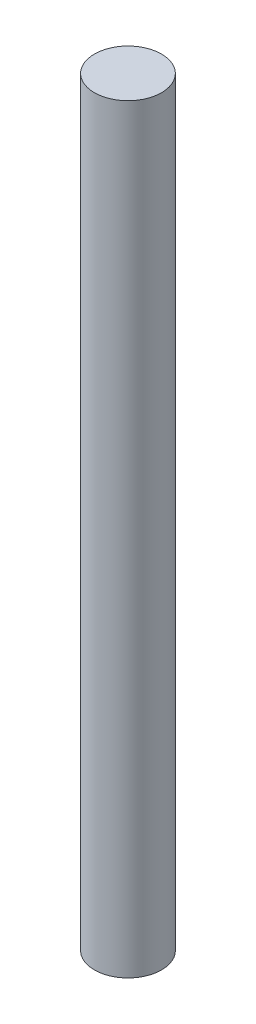
ISO-10303-21;
HEADER;
FILE_DESCRIPTION(('STEP AP214'),'2;1');
FILE_NAME('part.step','',(''),(''),'','','');
FILE_SCHEMA(('AUTOMOTIVE_DESIGN { 1 0 10303 214 1 1 1 1 }'));
ENDSEC;
DATA;
#1=APPLICATION_CONTEXT('core data for automotive mechanical design processes');
#2=APPLICATION_PROTOCOL_DEFINITION('international standard','automotive_design',2000,#1);
#3=PRODUCT_CONTEXT('',#1,'mechanical');
#4=PRODUCT('Part','Part','',(#3));
#5=PRODUCT_RELATED_PRODUCT_CATEGORY('part','',(#4));
#6=PRODUCT_DEFINITION_FORMATION('','',#4);
#7=PRODUCT_DEFINITION_CONTEXT('part definition',#1,'design');
#8=PRODUCT_DEFINITION('design','',#6,#7);
#9=PRODUCT_DEFINITION_SHAPE('','',#8);
#10=(LENGTH_UNIT() NAMED_UNIT(*) SI_UNIT(.MILLI.,.METRE.));
#11=(NAMED_UNIT(*) PLANE_ANGLE_UNIT() SI_UNIT($,.RADIAN.));
#12=(NAMED_UNIT(*) SI_UNIT($,.STERADIAN.) SOLID_ANGLE_UNIT());
#13=UNCERTAINTY_MEASURE_WITH_UNIT(LENGTH_MEASURE(1.E-05),#10,'distance_accuracy_value','');
#14=(GEOMETRIC_REPRESENTATION_CONTEXT(3) GLOBAL_UNCERTAINTY_ASSIGNED_CONTEXT((#13)) GLOBAL_UNIT_ASSIGNED_CONTEXT((#10,
#11,#12)) REPRESENTATION_CONTEXT('',''));
#15=CARTESIAN_POINT('',(0.,0.,0.));
#16=DIRECTION('',(0.,0.,1.));
#17=DIRECTION('',(1.,0.,0.));
#18=AXIS2_PLACEMENT_3D('',#15,#16,#17);
#19=CARTESIAN_POINT('',(0.,17.,0.));
#20=DIRECTION('',(0.,-1.,0.));
#21=DIRECTION('',(0.,0.,-1.));
#22=AXIS2_PLACEMENT_3D('',#19,#20,#21);
#23=CYLINDRICAL_SURFACE('',#22,1.5);
#24=CARTESIAN_POINT('',(0.,17.,0.));
#25=DIRECTION('',(0.,1.,0.));
#26=DIRECTION('',(0.,0.,1.));
#27=AXIS2_PLACEMENT_3D('',#24,#25,#26);
#28=CIRCLE('',#27,1.5);
#29=CARTESIAN_POINT('',(0.,17.,1.5));
#30=VERTEX_POINT('',#29);
#31=EDGE_CURVE('E10',#30,#30,#28,.T.);
#32=ORIENTED_EDGE('',*,*,#31,.F.);
#33=EDGE_LOOP('',(#32));
#34=FACE_BOUND('',#33,.T.);
#35=CARTESIAN_POINT('',(0.,-17.,0.));
#36=DIRECTION('',(0.,1.,0.));
#37=DIRECTION('',(0.,0.,1.));
#38=AXIS2_PLACEMENT_3D('',#35,#36,#37);
#39=CIRCLE('',#38,1.5);
#40=CARTESIAN_POINT('',(0.,-17.,1.5));
#41=VERTEX_POINT('',#40);
#42=EDGE_CURVE('E44',#41,#41,#39,.T.);
#43=ORIENTED_EDGE('',*,*,#42,.T.);
#44=EDGE_LOOP('',(#43));
#45=FACE_BOUND('',#44,.T.);
#46=ADVANCED_FACE('F41',(#34,#45),#23,.T.);
#47=CARTESIAN_POINT('',(0.,17.,0.));
#48=DIRECTION('',(0.,1.,0.));
#49=DIRECTION('',(0.,0.,1.));
#50=AXIS2_PLACEMENT_3D('',#47,#48,#49);
#51=PLANE('',#50);
#52=ORIENTED_EDGE('',*,*,#31,.T.);
#53=EDGE_LOOP('',(#52));
#54=FACE_BOUND('',#53,.T.);
#55=ADVANCED_FACE('F58',(#54),#51,.T.);
#56=CARTESIAN_POINT('',(0.,-17.,0.));
#57=DIRECTION('',(0.,1.,0.));
#58=DIRECTION('',(0.,0.,1.));
#59=AXIS2_PLACEMENT_3D('',#56,#57,#58);
#60=PLANE('',#59);
#61=ORIENTED_EDGE('',*,*,#42,.F.);
#62=EDGE_LOOP('',(#61));
#63=FACE_BOUND('',#62,.T.);
#64=ADVANCED_FACE('F56',(#63),#60,.F.);
#65=CLOSED_SHELL('',(#46,#55,#64));
#66=MANIFOLD_SOLID_BREP('B2',#65);
#67=ADVANCED_BREP_SHAPE_REPRESENTATION('',(#18,#66),#14);
#68=SHAPE_DEFINITION_REPRESENTATION(#9,#67);
ENDSEC;
END-ISO-10303-21;
